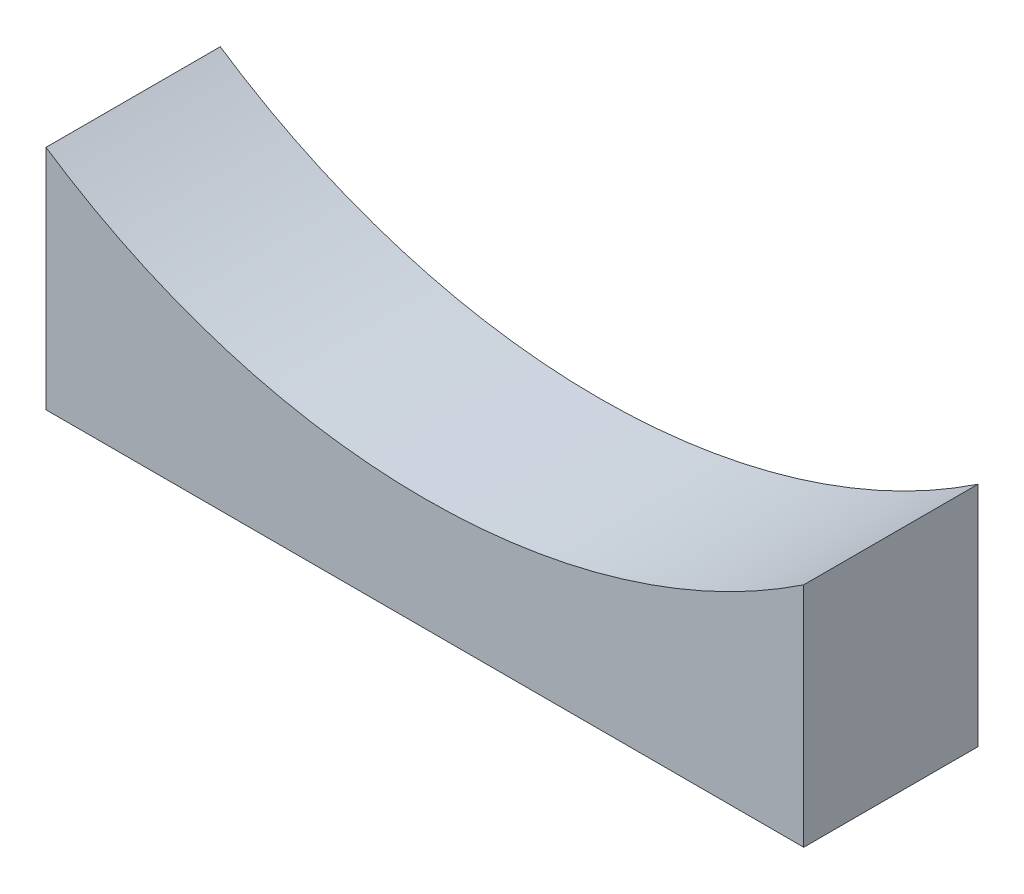
ISO-10303-21;
HEADER;
FILE_DESCRIPTION(('STEP AP214'),'2;1');
FILE_NAME('part.step','',(''),(''),'','','');
FILE_SCHEMA(('AUTOMOTIVE_DESIGN { 1 0 10303 214 1 1 1 1 }'));
ENDSEC;
DATA;
#1=APPLICATION_CONTEXT('core data for automotive mechanical design processes');
#2=APPLICATION_PROTOCOL_DEFINITION('international standard','automotive_design',2000,#1);
#3=PRODUCT_CONTEXT('',#1,'mechanical');
#4=PRODUCT('Part','Part','',(#3));
#5=PRODUCT_RELATED_PRODUCT_CATEGORY('part','',(#4));
#6=PRODUCT_DEFINITION_FORMATION('','',#4);
#7=PRODUCT_DEFINITION_CONTEXT('part definition',#1,'design');
#8=PRODUCT_DEFINITION('design','',#6,#7);
#9=PRODUCT_DEFINITION_SHAPE('','',#8);
#10=(LENGTH_UNIT() NAMED_UNIT(*) SI_UNIT(.MILLI.,.METRE.));
#11=(NAMED_UNIT(*) PLANE_ANGLE_UNIT() SI_UNIT($,.RADIAN.));
#12=(NAMED_UNIT(*) SI_UNIT($,.STERADIAN.) SOLID_ANGLE_UNIT());
#13=UNCERTAINTY_MEASURE_WITH_UNIT(LENGTH_MEASURE(1.E-05),#10,'distance_accuracy_value','');
#14=(GEOMETRIC_REPRESENTATION_CONTEXT(3) GLOBAL_UNCERTAINTY_ASSIGNED_CONTEXT((#13)) GLOBAL_UNIT_ASSIGNED_CONTEXT((#10,
#11,#12)) REPRESENTATION_CONTEXT('',''));
#15=CARTESIAN_POINT('',(0.,0.,0.));
#16=DIRECTION('',(0.,0.,1.));
#17=DIRECTION('',(1.,0.,0.));
#18=AXIS2_PLACEMENT_3D('',#15,#16,#17);
#19=CARTESIAN_POINT('',(0.,190.5,146.05));
#20=DIRECTION('',(1.,0.,0.));
#21=DIRECTION('',(0.,1.,0.));
#22=AXIS2_PLACEMENT_3D('',#19,#20,#21);
#23=PLANE('',#22);
#24=DIRECTION('',(0.,-1.,0.));
#25=VECTOR('',#24,1.);
#26=CARTESIAN_POINT('',(0.,190.5,0.));
#27=LINE('',#26,#25);
#28=CARTESIAN_POINT('',(-3.88578058618805E-13,190.5,0.));
#29=VERTEX_POINT('',#28);
#30=CARTESIAN_POINT('',(0.,0.,0.));
#31=VERTEX_POINT('',#30);
#32=EDGE_CURVE('E95',#29,#31,#27,.T.);
#33=ORIENTED_EDGE('',*,*,#32,.T.);
#34=DIRECTION('',(0.,0.,-1.));
#35=VECTOR('',#34,1.);
#36=CARTESIAN_POINT('',(0.,0.,146.05));
#37=LINE('',#36,#35);
#38=CARTESIAN_POINT('',(0.,0.,146.05));
#39=VERTEX_POINT('',#38);
#40=EDGE_CURVE('E11',#39,#31,#37,.T.);
#41=ORIENTED_EDGE('',*,*,#40,.F.);
#42=DIRECTION('',(0.,-1.,0.));
#43=VECTOR('',#42,1.);
#44=CARTESIAN_POINT('',(0.,190.5,146.05));
#45=LINE('',#44,#43);
#46=CARTESIAN_POINT('',(-3.88578058618805E-13,190.5,146.05));
#47=VERTEX_POINT('',#46);
#48=EDGE_CURVE('E83',#47,#39,#45,.T.);
#49=ORIENTED_EDGE('',*,*,#48,.F.);
#50=DIRECTION('',(0.,0.,-1.));
#51=VECTOR('',#50,1.);
#52=CARTESIAN_POINT('',(-3.88578058618805E-13,190.5,146.05));
#53=LINE('',#52,#51);
#54=EDGE_CURVE('E91',#47,#29,#53,.T.);
#55=ORIENTED_EDGE('',*,*,#54,.T.);
#56=EDGE_LOOP('',(#33,#41,#49,#55));
#57=FACE_BOUND('',#56,.T.);
#58=ADVANCED_FACE('F32',(#57),#23,.F.);
#59=CARTESIAN_POINT('',(0.,0.,146.05));
#60=DIRECTION('',(0.,1.,0.));
#61=DIRECTION('',(0.,0.,1.));
#62=AXIS2_PLACEMENT_3D('',#59,#60,#61);
#63=PLANE('',#62);
#64=DIRECTION('',(1.,0.,0.));
#65=VECTOR('',#64,1.);
#66=CARTESIAN_POINT('',(0.,0.,0.));
#67=LINE('',#66,#65);
#68=CARTESIAN_POINT('',(635.,0.,0.));
#69=VERTEX_POINT('',#68);
#70=EDGE_CURVE('E87',#31,#69,#67,.T.);
#71=ORIENTED_EDGE('',*,*,#70,.T.);
#72=DIRECTION('',(0.,0.,-1.));
#73=VECTOR('',#72,1.);
#74=CARTESIAN_POINT('',(635.,0.,146.05));
#75=LINE('',#74,#73);
#76=CARTESIAN_POINT('',(635.,0.,146.05));
#77=VERTEX_POINT('',#76);
#78=EDGE_CURVE('E40',#77,#69,#75,.T.);
#79=ORIENTED_EDGE('',*,*,#78,.F.);
#80=DIRECTION('',(1.,0.,0.));
#81=VECTOR('',#80,1.);
#82=CARTESIAN_POINT('',(0.,0.,146.05));
#83=LINE('',#82,#81);
#84=EDGE_CURVE('E78',#39,#77,#83,.T.);
#85=ORIENTED_EDGE('',*,*,#84,.F.);
#86=ORIENTED_EDGE('',*,*,#40,.T.);
#87=EDGE_LOOP('',(#71,#79,#85,#86));
#88=FACE_BOUND('',#87,.T.);
#89=ADVANCED_FACE('F86',(#88),#63,.F.);
#90=CARTESIAN_POINT('',(635.,190.5,146.05));
#91=DIRECTION('',(-1.,0.,0.));
#92=DIRECTION('',(0.,0.,1.));
#93=AXIS2_PLACEMENT_3D('',#90,#91,#92);
#94=PLANE('',#93);
#95=DIRECTION('',(0.,1.,0.));
#96=VECTOR('',#95,1.);
#97=CARTESIAN_POINT('',(635.,190.5,0.));
#98=LINE('',#97,#96);
#99=CARTESIAN_POINT('',(635.,190.5,0.));
#100=VERTEX_POINT('',#99);
#101=EDGE_CURVE('E65',#69,#100,#98,.T.);
#102=ORIENTED_EDGE('',*,*,#101,.T.);
#103=DIRECTION('',(0.,0.,-1.));
#104=VECTOR('',#103,1.);
#105=CARTESIAN_POINT('',(635.,190.5,146.05));
#106=LINE('',#105,#104);
#107=CARTESIAN_POINT('',(635.,190.5,146.05));
#108=VERTEX_POINT('',#107);
#109=EDGE_CURVE('E88',#108,#100,#106,.T.);
#110=ORIENTED_EDGE('',*,*,#109,.F.);
#111=DIRECTION('',(0.,1.,0.));
#112=VECTOR('',#111,1.);
#113=CARTESIAN_POINT('',(635.,190.5,146.05));
#114=LINE('',#113,#112);
#115=EDGE_CURVE('E81',#77,#108,#114,.T.);
#116=ORIENTED_EDGE('',*,*,#115,.F.);
#117=ORIENTED_EDGE('',*,*,#78,.T.);
#118=EDGE_LOOP('',(#102,#110,#116,#117));
#119=FACE_BOUND('',#118,.T.);
#120=ADVANCED_FACE('F89',(#119),#94,.F.);
#121=CARTESIAN_POINT('',(317.5,665.690488120291,146.05));
#122=DIRECTION('',(0.,0.,-1.));
#123=DIRECTION('',(-1.,0.,0.));
#124=AXIS2_PLACEMENT_3D('',#121,#122,#123);
#125=CYLINDRICAL_SURFACE('',#124,571.5);
#126=CARTESIAN_POINT('',(317.5,665.690488120291,0.));
#127=DIRECTION('',(0.,0.,-1.));
#128=DIRECTION('',(1.,0.,0.));
#129=AXIS2_PLACEMENT_3D('',#126,#127,#128);
#130=CIRCLE('',#129,571.5);
#131=EDGE_CURVE('E71',#100,#29,#130,.T.);
#132=ORIENTED_EDGE('',*,*,#131,.T.);
#133=ORIENTED_EDGE('',*,*,#54,.F.);
#134=CARTESIAN_POINT('',(317.5,665.690488120291,146.05));
#135=DIRECTION('',(0.,0.,-1.));
#136=DIRECTION('',(1.,0.,0.));
#137=AXIS2_PLACEMENT_3D('',#134,#135,#136);
#138=CIRCLE('',#137,571.5);
#139=EDGE_CURVE('E48',#108,#47,#138,.T.);
#140=ORIENTED_EDGE('',*,*,#139,.F.);
#141=ORIENTED_EDGE('',*,*,#109,.T.);
#142=EDGE_LOOP('',(#132,#133,#140,#141));
#143=FACE_BOUND('',#142,.T.);
#144=ADVANCED_FACE('F102',(#143),#125,.F.);
#145=CARTESIAN_POINT('',(317.5,665.690488120291,146.05));
#146=DIRECTION('',(0.,0.,1.));
#147=DIRECTION('',(1.,0.,0.));
#148=AXIS2_PLACEMENT_3D('',#145,#146,#147);
#149=PLANE('',#148);
#150=ORIENTED_EDGE('',*,*,#48,.T.);
#151=ORIENTED_EDGE('',*,*,#84,.T.);
#152=ORIENTED_EDGE('',*,*,#115,.T.);
#153=ORIENTED_EDGE('',*,*,#139,.T.);
#154=EDGE_LOOP('',(#150,#151,#152,#153));
#155=FACE_BOUND('',#154,.T.);
#156=ADVANCED_FACE('F79',(#155),#149,.T.);
#157=CARTESIAN_POINT('',(317.5,665.690488120291,0.));
#158=DIRECTION('',(0.,0.,1.));
#159=DIRECTION('',(1.,0.,0.));
#160=AXIS2_PLACEMENT_3D('',#157,#158,#159);
#161=PLANE('',#160);
#162=ORIENTED_EDGE('',*,*,#32,.F.);
#163=ORIENTED_EDGE('',*,*,#131,.F.);
#164=ORIENTED_EDGE('',*,*,#101,.F.);
#165=ORIENTED_EDGE('',*,*,#70,.F.);
#166=EDGE_LOOP('',(#162,#163,#164,#165));
#167=FACE_BOUND('',#166,.T.);
#168=ADVANCED_FACE('F105',(#167),#161,.F.);
#169=CLOSED_SHELL('',(#58,#89,#120,#144,#156,#168));
#170=MANIFOLD_SOLID_BREP('B2',#169);
#171=ADVANCED_BREP_SHAPE_REPRESENTATION('',(#18,#170),#14);
#172=SHAPE_DEFINITION_REPRESENTATION(#9,#171);
ENDSEC;
END-ISO-10303-21;
